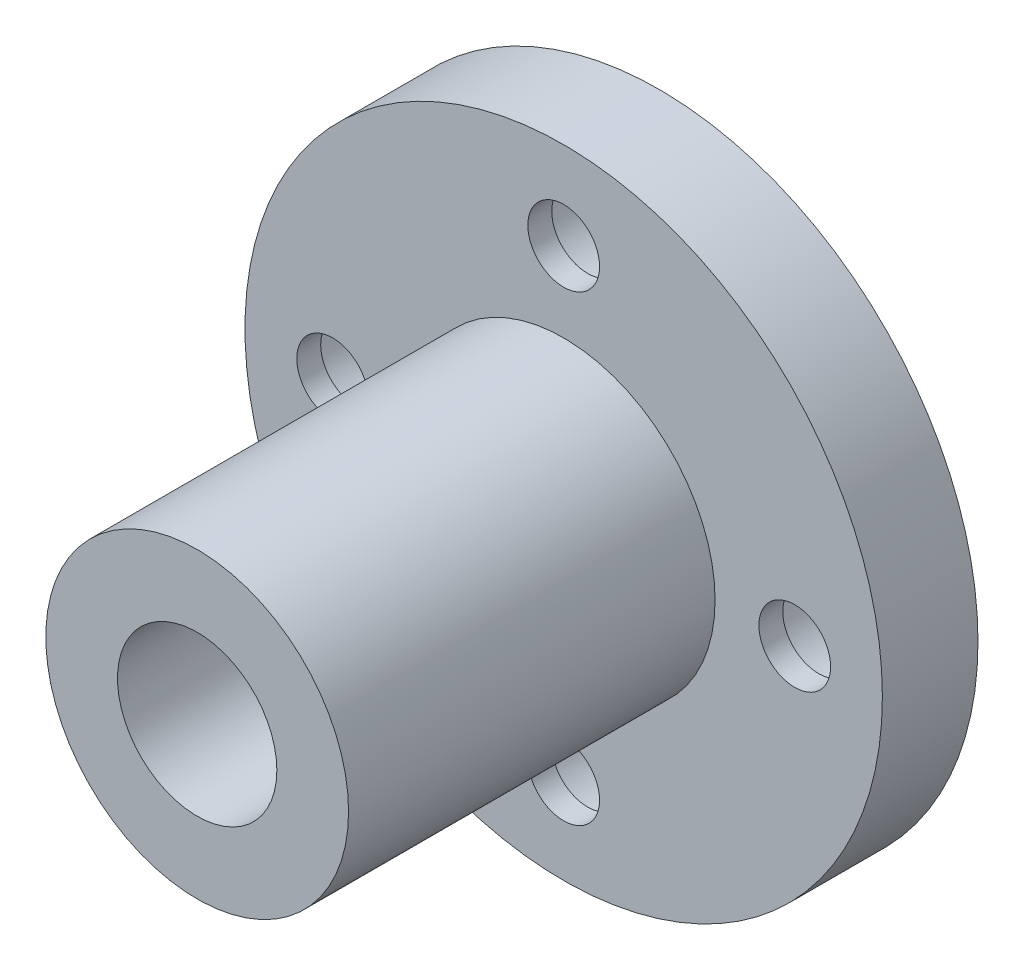
ISO-10303-21;
HEADER;
FILE_DESCRIPTION(('STEP AP214'),'2;1');
FILE_NAME('part.step','',(''),(''),'','','');
FILE_SCHEMA(('AUTOMOTIVE_DESIGN { 1 0 10303 214 1 1 1 1 }'));
ENDSEC;
DATA;
#1=APPLICATION_CONTEXT('core data for automotive mechanical design processes');
#2=APPLICATION_PROTOCOL_DEFINITION('international standard','automotive_design',2000,#1);
#3=PRODUCT_CONTEXT('',#1,'mechanical');
#4=PRODUCT('Part','Part','',(#3));
#5=PRODUCT_RELATED_PRODUCT_CATEGORY('part','',(#4));
#6=PRODUCT_DEFINITION_FORMATION('','',#4);
#7=PRODUCT_DEFINITION_CONTEXT('part definition',#1,'design');
#8=PRODUCT_DEFINITION('design','',#6,#7);
#9=PRODUCT_DEFINITION_SHAPE('','',#8);
#10=(LENGTH_UNIT() NAMED_UNIT(*) SI_UNIT(.MILLI.,.METRE.));
#11=(NAMED_UNIT(*) PLANE_ANGLE_UNIT() SI_UNIT($,.RADIAN.));
#12=(NAMED_UNIT(*) SI_UNIT($,.STERADIAN.) SOLID_ANGLE_UNIT());
#13=UNCERTAINTY_MEASURE_WITH_UNIT(LENGTH_MEASURE(1.E-05),#10,'distance_accuracy_value','');
#14=(GEOMETRIC_REPRESENTATION_CONTEXT(3) GLOBAL_UNCERTAINTY_ASSIGNED_CONTEXT((#13)) GLOBAL_UNIT_ASSIGNED_CONTEXT((#10,
#11,#12)) REPRESENTATION_CONTEXT('',''));
#15=CARTESIAN_POINT('',(0.,0.,0.));
#16=DIRECTION('',(0.,0.,1.));
#17=DIRECTION('',(1.,0.,0.));
#18=AXIS2_PLACEMENT_3D('',#15,#16,#17);
#19=CARTESIAN_POINT('',(14.5,0.,6.));
#20=DIRECTION('',(0.,0.,-1.));
#21=DIRECTION('',(-1.,0.,0.));
#22=AXIS2_PLACEMENT_3D('',#19,#20,#21);
#23=CYLINDRICAL_SURFACE('',#22,2.25);
#24=CARTESIAN_POINT('',(14.5,0.,6.));
#25=DIRECTION('',(0.,0.,1.));
#26=DIRECTION('',(1.,0.,0.));
#27=AXIS2_PLACEMENT_3D('',#24,#25,#26);
#28=CIRCLE('',#27,2.25);
#29=CARTESIAN_POINT('',(16.75,0.,6.));
#30=VERTEX_POINT('',#29);
#31=EDGE_CURVE('E89',#30,#30,#28,.T.);
#32=ORIENTED_EDGE('',*,*,#31,.T.);
#33=EDGE_LOOP('',(#32));
#34=FACE_BOUND('',#33,.T.);
#35=CARTESIAN_POINT('',(14.5,0.,4.5));
#36=DIRECTION('',(0.,0.,-1.));
#37=DIRECTION('',(-1.,0.,0.));
#38=AXIS2_PLACEMENT_3D('',#35,#36,#37);
#39=CIRCLE('',#38,2.25);
#40=CARTESIAN_POINT('',(12.25,0.,4.5));
#41=VERTEX_POINT('',#40);
#42=EDGE_CURVE('E37',#41,#41,#39,.T.);
#43=ORIENTED_EDGE('',*,*,#42,.T.);
#44=EDGE_LOOP('',(#43));
#45=FACE_BOUND('',#44,.T.);
#46=ADVANCED_FACE('F33',(#34,#45),#23,.F.);
#47=CARTESIAN_POINT('',(0.,-14.5,6.));
#48=DIRECTION('',(0.,0.,-1.));
#49=DIRECTION('',(-1.,0.,0.));
#50=AXIS2_PLACEMENT_3D('',#47,#48,#49);
#51=CYLINDRICAL_SURFACE('',#50,2.25);
#52=CARTESIAN_POINT('',(0.,-14.5,6.));
#53=DIRECTION('',(0.,0.,1.));
#54=DIRECTION('',(1.,0.,0.));
#55=AXIS2_PLACEMENT_3D('',#52,#53,#54);
#56=CIRCLE('',#55,2.25);
#57=CARTESIAN_POINT('',(2.25,-14.5,6.));
#58=VERTEX_POINT('',#57);
#59=EDGE_CURVE('E86',#58,#58,#56,.T.);
#60=ORIENTED_EDGE('',*,*,#59,.T.);
#61=EDGE_LOOP('',(#60));
#62=FACE_BOUND('',#61,.T.);
#63=CARTESIAN_POINT('',(0.,-14.5,4.5));
#64=DIRECTION('',(0.,0.,-1.));
#65=DIRECTION('',(-1.,0.,0.));
#66=AXIS2_PLACEMENT_3D('',#63,#64,#65);
#67=CIRCLE('',#66,2.25);
#68=CARTESIAN_POINT('',(-2.25,-14.5,4.5));
#69=VERTEX_POINT('',#68);
#70=EDGE_CURVE('E58',#69,#69,#67,.T.);
#71=ORIENTED_EDGE('',*,*,#70,.T.);
#72=EDGE_LOOP('',(#71));
#73=FACE_BOUND('',#72,.T.);
#74=ADVANCED_FACE('F119',(#62,#73),#51,.F.);
#75=CARTESIAN_POINT('',(-14.5,0.,6.));
#76=DIRECTION('',(0.,0.,-1.));
#77=DIRECTION('',(-1.,0.,0.));
#78=AXIS2_PLACEMENT_3D('',#75,#76,#77);
#79=CYLINDRICAL_SURFACE('',#78,2.25);
#80=CARTESIAN_POINT('',(-14.5,0.,6.));
#81=DIRECTION('',(0.,0.,1.));
#82=DIRECTION('',(1.,0.,0.));
#83=AXIS2_PLACEMENT_3D('',#80,#81,#82);
#84=CIRCLE('',#83,2.25);
#85=CARTESIAN_POINT('',(-12.25,0.,6.));
#86=VERTEX_POINT('',#85);
#87=EDGE_CURVE('E81',#86,#86,#84,.T.);
#88=ORIENTED_EDGE('',*,*,#87,.T.);
#89=EDGE_LOOP('',(#88));
#90=FACE_BOUND('',#89,.T.);
#91=CARTESIAN_POINT('',(-14.5,0.,4.5));
#92=DIRECTION('',(0.,0.,-1.));
#93=DIRECTION('',(-1.,0.,0.));
#94=AXIS2_PLACEMENT_3D('',#91,#92,#93);
#95=CIRCLE('',#94,2.25);
#96=CARTESIAN_POINT('',(-16.75,0.,4.5));
#97=VERTEX_POINT('',#96);
#98=EDGE_CURVE('E56',#97,#97,#95,.T.);
#99=ORIENTED_EDGE('',*,*,#98,.T.);
#100=EDGE_LOOP('',(#99));
#101=FACE_BOUND('',#100,.T.);
#102=ADVANCED_FACE('F125',(#90,#101),#79,.F.);
#103=CARTESIAN_POINT('',(0.,14.5,6.));
#104=DIRECTION('',(0.,0.,-1.));
#105=DIRECTION('',(-1.,0.,0.));
#106=AXIS2_PLACEMENT_3D('',#103,#104,#105);
#107=CYLINDRICAL_SURFACE('',#106,2.25);
#108=CARTESIAN_POINT('',(0.,14.5,6.));
#109=DIRECTION('',(0.,0.,1.));
#110=DIRECTION('',(1.,0.,0.));
#111=AXIS2_PLACEMENT_3D('',#108,#109,#110);
#112=CIRCLE('',#111,2.25);
#113=CARTESIAN_POINT('',(2.25,14.5,6.));
#114=VERTEX_POINT('',#113);
#115=EDGE_CURVE('E91',#114,#114,#112,.T.);
#116=ORIENTED_EDGE('',*,*,#115,.T.);
#117=EDGE_LOOP('',(#116));
#118=FACE_BOUND('',#117,.T.);
#119=CARTESIAN_POINT('',(0.,14.5,4.5));
#120=DIRECTION('',(0.,0.,-1.));
#121=DIRECTION('',(-1.,0.,0.));
#122=AXIS2_PLACEMENT_3D('',#119,#120,#121);
#123=CIRCLE('',#122,2.25);
#124=CARTESIAN_POINT('',(-2.25,14.5,4.5));
#125=VERTEX_POINT('',#124);
#126=EDGE_CURVE('E51',#125,#125,#123,.T.);
#127=ORIENTED_EDGE('',*,*,#126,.T.);
#128=EDGE_LOOP('',(#127));
#129=FACE_BOUND('',#128,.T.);
#130=ADVANCED_FACE('F130',(#118,#129),#107,.F.);
#131=CARTESIAN_POINT('',(0.,0.,6.));
#132=DIRECTION('',(0.,0.,1.));
#133=DIRECTION('',(1.,0.,0.));
#134=AXIS2_PLACEMENT_3D('',#131,#132,#133);
#135=PLANE('',#134);
#136=ORIENTED_EDGE('',*,*,#87,.F.);
#137=EDGE_LOOP('',(#136));
#138=FACE_BOUND('',#137,.T.);
#139=ORIENTED_EDGE('',*,*,#31,.F.);
#140=EDGE_LOOP('',(#139));
#141=FACE_BOUND('',#140,.T.);
#142=CARTESIAN_POINT('',(0.,0.,6.));
#143=DIRECTION('',(0.,0.,1.));
#144=DIRECTION('',(1.,0.,0.));
#145=AXIS2_PLACEMENT_3D('',#142,#143,#144);
#146=CIRCLE('',#145,20.);
#147=CARTESIAN_POINT('',(20.,0.,6.));
#148=VERTEX_POINT('',#147);
#149=EDGE_CURVE('E10',#148,#148,#146,.T.);
#150=ORIENTED_EDGE('',*,*,#149,.T.);
#151=EDGE_LOOP('',(#150));
#152=FACE_BOUND('',#151,.T.);
#153=ORIENTED_EDGE('',*,*,#115,.F.);
#154=EDGE_LOOP('',(#153));
#155=FACE_BOUND('',#154,.T.);
#156=ORIENTED_EDGE('',*,*,#59,.F.);
#157=EDGE_LOOP('',(#156));
#158=FACE_BOUND('',#157,.T.);
#159=CARTESIAN_POINT('',(0.,0.,6.));
#160=DIRECTION('',(0.,0.,1.));
#161=DIRECTION('',(1.,0.,0.));
#162=AXIS2_PLACEMENT_3D('',#159,#160,#161);
#163=CIRCLE('',#162,9.5);
#164=CARTESIAN_POINT('',(9.5,0.,6.));
#165=VERTEX_POINT('',#164);
#166=EDGE_CURVE('E77',#165,#165,#163,.T.);
#167=ORIENTED_EDGE('',*,*,#166,.F.);
#168=EDGE_LOOP('',(#167));
#169=FACE_BOUND('',#168,.T.);
#170=ADVANCED_FACE('F132',(#138,#141,#152,#155,#158,#169),#135,.T.);
#171=CARTESIAN_POINT('',(0.,0.,0.));
#172=DIRECTION('',(0.,0.,1.));
#173=DIRECTION('',(1.,0.,0.));
#174=AXIS2_PLACEMENT_3D('',#171,#172,#173);
#175=PLANE('',#174);
#176=CARTESIAN_POINT('',(-14.5,0.,0.));
#177=DIRECTION('',(0.,0.,-1.));
#178=DIRECTION('',(-1.,0.,0.));
#179=AXIS2_PLACEMENT_3D('',#176,#177,#178);
#180=CIRCLE('',#179,3.75);
#181=CARTESIAN_POINT('',(-18.25,0.,0.));
#182=VERTEX_POINT('',#181);
#183=EDGE_CURVE('E145',#182,#182,#180,.T.);
#184=ORIENTED_EDGE('',*,*,#183,.F.);
#185=EDGE_LOOP('',(#184));
#186=FACE_BOUND('',#185,.T.);
#187=CARTESIAN_POINT('',(0.,-14.5,0.));
#188=DIRECTION('',(0.,0.,-1.));
#189=DIRECTION('',(-1.,0.,0.));
#190=AXIS2_PLACEMENT_3D('',#187,#188,#189);
#191=CIRCLE('',#190,3.75);
#192=CARTESIAN_POINT('',(-3.75,-14.5,0.));
#193=VERTEX_POINT('',#192);
#194=EDGE_CURVE('E149',#193,#193,#191,.T.);
#195=ORIENTED_EDGE('',*,*,#194,.F.);
#196=EDGE_LOOP('',(#195));
#197=FACE_BOUND('',#196,.T.);
#198=CARTESIAN_POINT('',(14.5,0.,0.));
#199=DIRECTION('',(0.,0.,-1.));
#200=DIRECTION('',(-1.,0.,0.));
#201=AXIS2_PLACEMENT_3D('',#198,#199,#200);
#202=CIRCLE('',#201,3.75);
#203=CARTESIAN_POINT('',(10.75,0.,0.));
#204=VERTEX_POINT('',#203);
#205=EDGE_CURVE('E153',#204,#204,#202,.T.);
#206=ORIENTED_EDGE('',*,*,#205,.F.);
#207=EDGE_LOOP('',(#206));
#208=FACE_BOUND('',#207,.T.);
#209=CARTESIAN_POINT('',(0.,14.5,0.));
#210=DIRECTION('',(0.,0.,-1.));
#211=DIRECTION('',(-1.,0.,0.));
#212=AXIS2_PLACEMENT_3D('',#209,#210,#211);
#213=CIRCLE('',#212,3.75);
#214=CARTESIAN_POINT('',(-3.75,14.5,0.));
#215=VERTEX_POINT('',#214);
#216=EDGE_CURVE('E64',#215,#215,#213,.T.);
#217=ORIENTED_EDGE('',*,*,#216,.F.);
#218=EDGE_LOOP('',(#217));
#219=FACE_BOUND('',#218,.T.);
#220=CARTESIAN_POINT('',(0.,0.,0.));
#221=DIRECTION('',(0.,0.,1.));
#222=DIRECTION('',(1.,0.,0.));
#223=AXIS2_PLACEMENT_3D('',#220,#221,#222);
#224=CIRCLE('',#223,20.);
#225=CARTESIAN_POINT('',(20.,0.,0.));
#226=VERTEX_POINT('',#225);
#227=EDGE_CURVE('E41',#226,#226,#224,.T.);
#228=ORIENTED_EDGE('',*,*,#227,.F.);
#229=EDGE_LOOP('',(#228));
#230=FACE_BOUND('',#229,.T.);
#231=CARTESIAN_POINT('',(0.,0.,0.));
#232=DIRECTION('',(0.,0.,1.));
#233=DIRECTION('',(1.,0.,0.));
#234=AXIS2_PLACEMENT_3D('',#231,#232,#233);
#235=CIRCLE('',#234,5.);
#236=CARTESIAN_POINT('',(5.,0.,0.));
#237=VERTEX_POINT('',#236);
#238=EDGE_CURVE('E46',#237,#237,#235,.T.);
#239=ORIENTED_EDGE('',*,*,#238,.T.);
#240=EDGE_LOOP('',(#239));
#241=FACE_BOUND('',#240,.T.);
#242=ADVANCED_FACE('F98',(#186,#197,#208,#219,#230,#241),#175,.F.);
#243=CARTESIAN_POINT('',(0.,0.,6.));
#244=DIRECTION('',(0.,0.,-1.));
#245=DIRECTION('',(-1.,0.,0.));
#246=AXIS2_PLACEMENT_3D('',#243,#244,#245);
#247=CYLINDRICAL_SURFACE('',#246,20.);
#248=ORIENTED_EDGE('',*,*,#149,.F.);
#249=EDGE_LOOP('',(#248));
#250=FACE_BOUND('',#249,.T.);
#251=ORIENTED_EDGE('',*,*,#227,.T.);
#252=EDGE_LOOP('',(#251));
#253=FACE_BOUND('',#252,.T.);
#254=ADVANCED_FACE('F35',(#250,#253),#247,.T.);
#255=CARTESIAN_POINT('',(0.,0.,6.));
#256=DIRECTION('',(0.,0.,-1.));
#257=DIRECTION('',(-1.,0.,0.));
#258=AXIS2_PLACEMENT_3D('',#255,#256,#257);
#259=CYLINDRICAL_SURFACE('',#258,5.);
#260=ORIENTED_EDGE('',*,*,#238,.F.);
#261=EDGE_LOOP('',(#260));
#262=FACE_BOUND('',#261,.T.);
#263=CARTESIAN_POINT('',(0.,0.,29.));
#264=DIRECTION('',(0.,0.,1.));
#265=DIRECTION('',(1.,0.,0.));
#266=AXIS2_PLACEMENT_3D('',#263,#264,#265);
#267=CIRCLE('',#266,5.);
#268=CARTESIAN_POINT('',(5.,0.,29.));
#269=VERTEX_POINT('',#268);
#270=EDGE_CURVE('E54',#269,#269,#267,.T.);
#271=ORIENTED_EDGE('',*,*,#270,.T.);
#272=EDGE_LOOP('',(#271));
#273=FACE_BOUND('',#272,.T.);
#274=ADVANCED_FACE('F100',(#262,#273),#259,.F.);
#275=CARTESIAN_POINT('',(0.,0.,29.));
#276=DIRECTION('',(0.,0.,1.));
#277=DIRECTION('',(1.,0.,0.));
#278=AXIS2_PLACEMENT_3D('',#275,#276,#277);
#279=PLANE('',#278);
#280=CARTESIAN_POINT('',(0.,0.,29.));
#281=DIRECTION('',(0.,0.,1.));
#282=DIRECTION('',(1.,0.,0.));
#283=AXIS2_PLACEMENT_3D('',#280,#281,#282);
#284=CIRCLE('',#283,9.5);
#285=CARTESIAN_POINT('',(9.5,0.,29.));
#286=VERTEX_POINT('',#285);
#287=EDGE_CURVE('E78',#286,#286,#284,.T.);
#288=ORIENTED_EDGE('',*,*,#287,.T.);
#289=EDGE_LOOP('',(#288));
#290=FACE_BOUND('',#289,.T.);
#291=ORIENTED_EDGE('',*,*,#270,.F.);
#292=EDGE_LOOP('',(#291));
#293=FACE_BOUND('',#292,.T.);
#294=ADVANCED_FACE('F103',(#290,#293),#279,.T.);
#295=CARTESIAN_POINT('',(0.,0.,29.));
#296=DIRECTION('',(0.,0.,-1.));
#297=DIRECTION('',(-1.,0.,0.));
#298=AXIS2_PLACEMENT_3D('',#295,#296,#297);
#299=CYLINDRICAL_SURFACE('',#298,9.5);
#300=ORIENTED_EDGE('',*,*,#287,.F.);
#301=EDGE_LOOP('',(#300));
#302=FACE_BOUND('',#301,.T.);
#303=ORIENTED_EDGE('',*,*,#166,.T.);
#304=EDGE_LOOP('',(#303));
#305=FACE_BOUND('',#304,.T.);
#306=ADVANCED_FACE('F108',(#302,#305),#299,.T.);
#307=CARTESIAN_POINT('',(0.,14.5,4.5));
#308=DIRECTION('',(0.,0.,-1.));
#309=DIRECTION('',(-1.,0.,0.));
#310=AXIS2_PLACEMENT_3D('',#307,#308,#309);
#311=CYLINDRICAL_SURFACE('',#310,3.75);
#312=CARTESIAN_POINT('',(0.,14.5,4.5));
#313=DIRECTION('',(0.,0.,-1.));
#314=DIRECTION('',(-1.,0.,0.));
#315=AXIS2_PLACEMENT_3D('',#312,#313,#314);
#316=CIRCLE('',#315,3.75);
#317=CARTESIAN_POINT('',(-3.75,14.5,4.5));
#318=VERTEX_POINT('',#317);
#319=EDGE_CURVE('E55',#318,#318,#316,.T.);
#320=ORIENTED_EDGE('',*,*,#319,.F.);
#321=EDGE_LOOP('',(#320));
#322=FACE_BOUND('',#321,.T.);
#323=ORIENTED_EDGE('',*,*,#216,.T.);
#324=EDGE_LOOP('',(#323));
#325=FACE_BOUND('',#324,.T.);
#326=ADVANCED_FACE('F114',(#322,#325),#311,.F.);
#327=CARTESIAN_POINT('',(0.,14.5,4.5));
#328=DIRECTION('',(0.,0.,-1.));
#329=DIRECTION('',(-1.,0.,0.));
#330=AXIS2_PLACEMENT_3D('',#327,#328,#329);
#331=PLANE('',#330);
#332=ORIENTED_EDGE('',*,*,#126,.F.);
#333=EDGE_LOOP('',(#332));
#334=FACE_BOUND('',#333,.T.);
#335=ORIENTED_EDGE('',*,*,#319,.T.);
#336=EDGE_LOOP('',(#335));
#337=FACE_BOUND('',#336,.T.);
#338=ADVANCED_FACE('F175',(#334,#337),#331,.T.);
#339=CARTESIAN_POINT('',(-14.5,0.,4.5));
#340=DIRECTION('',(0.,0.,-1.));
#341=DIRECTION('',(-1.,0.,0.));
#342=AXIS2_PLACEMENT_3D('',#339,#340,#341);
#343=CYLINDRICAL_SURFACE('',#342,3.75);
#344=CARTESIAN_POINT('',(-14.5,0.,4.5));
#345=DIRECTION('',(0.,0.,-1.));
#346=DIRECTION('',(-1.,0.,0.));
#347=AXIS2_PLACEMENT_3D('',#344,#345,#346);
#348=CIRCLE('',#347,3.75);
#349=CARTESIAN_POINT('',(-18.25,0.,4.5));
#350=VERTEX_POINT('',#349);
#351=EDGE_CURVE('E59',#350,#350,#348,.T.);
#352=ORIENTED_EDGE('',*,*,#351,.F.);
#353=EDGE_LOOP('',(#352));
#354=FACE_BOUND('',#353,.T.);
#355=ORIENTED_EDGE('',*,*,#183,.T.);
#356=EDGE_LOOP('',(#355));
#357=FACE_BOUND('',#356,.T.);
#358=ADVANCED_FACE('F172',(#354,#357),#343,.F.);
#359=CARTESIAN_POINT('',(-14.5,0.,4.5));
#360=DIRECTION('',(0.,0.,-1.));
#361=DIRECTION('',(-1.,0.,0.));
#362=AXIS2_PLACEMENT_3D('',#359,#360,#361);
#363=PLANE('',#362);
#364=ORIENTED_EDGE('',*,*,#98,.F.);
#365=EDGE_LOOP('',(#364));
#366=FACE_BOUND('',#365,.T.);
#367=ORIENTED_EDGE('',*,*,#351,.T.);
#368=EDGE_LOOP('',(#367));
#369=FACE_BOUND('',#368,.T.);
#370=ADVANCED_FACE('F170',(#366,#369),#363,.T.);
#371=CARTESIAN_POINT('',(0.,-14.5,4.5));
#372=DIRECTION('',(0.,0.,-1.));
#373=DIRECTION('',(-1.,0.,0.));
#374=AXIS2_PLACEMENT_3D('',#371,#372,#373);
#375=CYLINDRICAL_SURFACE('',#374,3.75);
#376=CARTESIAN_POINT('',(0.,-14.5,4.5));
#377=DIRECTION('',(0.,0.,-1.));
#378=DIRECTION('',(-1.,0.,0.));
#379=AXIS2_PLACEMENT_3D('',#376,#377,#378);
#380=CIRCLE('',#379,3.75);
#381=CARTESIAN_POINT('',(-3.75,-14.5,4.5));
#382=VERTEX_POINT('',#381);
#383=EDGE_CURVE('E163',#382,#382,#380,.T.);
#384=ORIENTED_EDGE('',*,*,#383,.F.);
#385=EDGE_LOOP('',(#384));
#386=FACE_BOUND('',#385,.T.);
#387=ORIENTED_EDGE('',*,*,#194,.T.);
#388=EDGE_LOOP('',(#387));
#389=FACE_BOUND('',#388,.T.);
#390=ADVANCED_FACE('F181',(#386,#389),#375,.F.);
#391=CARTESIAN_POINT('',(0.,-14.5,4.5));
#392=DIRECTION('',(0.,0.,-1.));
#393=DIRECTION('',(-1.,0.,0.));
#394=AXIS2_PLACEMENT_3D('',#391,#392,#393);
#395=PLANE('',#394);
#396=ORIENTED_EDGE('',*,*,#70,.F.);
#397=EDGE_LOOP('',(#396));
#398=FACE_BOUND('',#397,.T.);
#399=ORIENTED_EDGE('',*,*,#383,.T.);
#400=EDGE_LOOP('',(#399));
#401=FACE_BOUND('',#400,.T.);
#402=ADVANCED_FACE('F187',(#398,#401),#395,.T.);
#403=CARTESIAN_POINT('',(14.5,0.,4.5));
#404=DIRECTION('',(0.,0.,-1.));
#405=DIRECTION('',(-1.,0.,0.));
#406=AXIS2_PLACEMENT_3D('',#403,#404,#405);
#407=CYLINDRICAL_SURFACE('',#406,3.75);
#408=CARTESIAN_POINT('',(14.5,0.,4.5));
#409=DIRECTION('',(0.,0.,-1.));
#410=DIRECTION('',(-1.,0.,0.));
#411=AXIS2_PLACEMENT_3D('',#408,#409,#410);
#412=CIRCLE('',#411,3.75);
#413=CARTESIAN_POINT('',(10.75,0.,4.5));
#414=VERTEX_POINT('',#413);
#415=EDGE_CURVE('E158',#414,#414,#412,.T.);
#416=ORIENTED_EDGE('',*,*,#415,.F.);
#417=EDGE_LOOP('',(#416));
#418=FACE_BOUND('',#417,.T.);
#419=ORIENTED_EDGE('',*,*,#205,.T.);
#420=EDGE_LOOP('',(#419));
#421=FACE_BOUND('',#420,.T.);
#422=ADVANCED_FACE('F190',(#418,#421),#407,.F.);
#423=CARTESIAN_POINT('',(14.5,0.,4.5));
#424=DIRECTION('',(0.,0.,-1.));
#425=DIRECTION('',(-1.,0.,0.));
#426=AXIS2_PLACEMENT_3D('',#423,#424,#425);
#427=PLANE('',#426);
#428=ORIENTED_EDGE('',*,*,#42,.F.);
#429=EDGE_LOOP('',(#428));
#430=FACE_BOUND('',#429,.T.);
#431=ORIENTED_EDGE('',*,*,#415,.T.);
#432=EDGE_LOOP('',(#431));
#433=FACE_BOUND('',#432,.T.);
#434=ADVANCED_FACE('F195',(#430,#433),#427,.T.);
#435=CLOSED_SHELL('',(#46,#74,#102,#130,#170,#242,#254,#274,#294,#306,#326,#338,#358,#370,#390,
#402,#422,#434));
#436=MANIFOLD_SOLID_BREP('B2',#435);
#437=ADVANCED_BREP_SHAPE_REPRESENTATION('',(#18,#436),#14);
#438=SHAPE_DEFINITION_REPRESENTATION(#9,#437);
ENDSEC;
END-ISO-10303-21;
